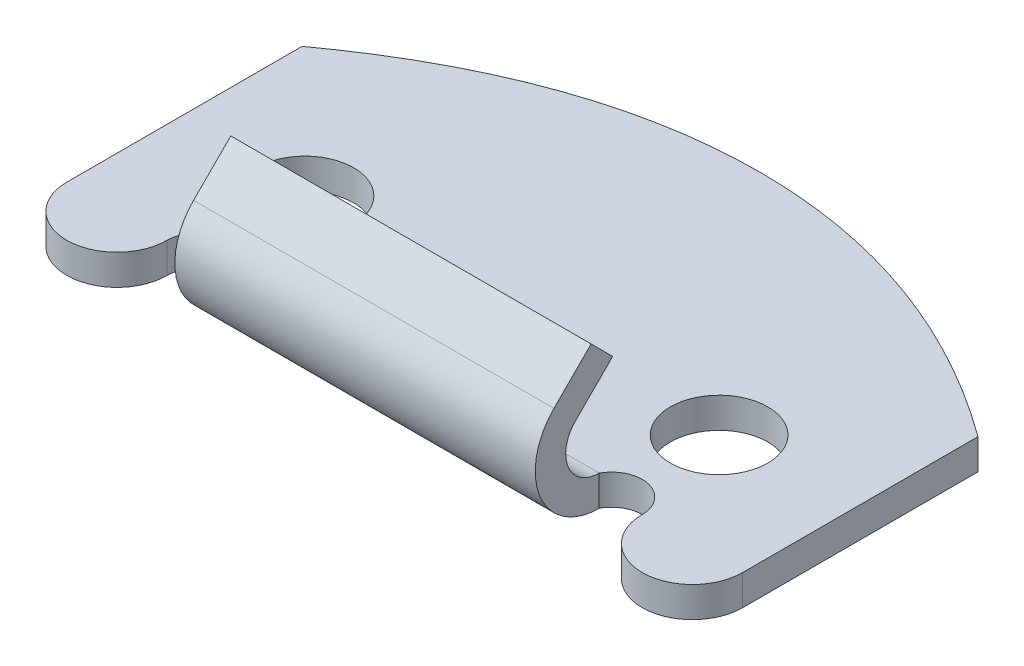
ISO-10303-21;
HEADER;
FILE_DESCRIPTION(('STEP AP214'),'2;1');
FILE_NAME('part.step','',(''),(''),'','','');
FILE_SCHEMA(('AUTOMOTIVE_DESIGN { 1 0 10303 214 1 1 1 1 }'));
ENDSEC;
DATA;
#1=APPLICATION_CONTEXT('core data for automotive mechanical design processes');
#2=APPLICATION_PROTOCOL_DEFINITION('international standard','automotive_design',2000,#1);
#3=PRODUCT_CONTEXT('',#1,'mechanical');
#4=PRODUCT('Part','Part','',(#3));
#5=PRODUCT_RELATED_PRODUCT_CATEGORY('part','',(#4));
#6=PRODUCT_DEFINITION_FORMATION('','',#4);
#7=PRODUCT_DEFINITION_CONTEXT('part definition',#1,'design');
#8=PRODUCT_DEFINITION('design','',#6,#7);
#9=PRODUCT_DEFINITION_SHAPE('','',#8);
#10=(LENGTH_UNIT() NAMED_UNIT(*) SI_UNIT(.MILLI.,.METRE.));
#11=(NAMED_UNIT(*) PLANE_ANGLE_UNIT() SI_UNIT($,.RADIAN.));
#12=(NAMED_UNIT(*) SI_UNIT($,.STERADIAN.) SOLID_ANGLE_UNIT());
#13=UNCERTAINTY_MEASURE_WITH_UNIT(LENGTH_MEASURE(1.E-05),#10,'distance_accuracy_value','');
#14=(GEOMETRIC_REPRESENTATION_CONTEXT(3) GLOBAL_UNCERTAINTY_ASSIGNED_CONTEXT((#13)) GLOBAL_UNIT_ASSIGNED_CONTEXT((#10,
#11,#12)) REPRESENTATION_CONTEXT('',''));
#15=CARTESIAN_POINT('',(0.,0.,0.));
#16=DIRECTION('',(0.,0.,1.));
#17=DIRECTION('',(1.,0.,0.));
#18=AXIS2_PLACEMENT_3D('',#15,#16,#17);
#19=CARTESIAN_POINT('',(-5.61946223736205,1.,-7.15922169796895));
#20=DIRECTION('',(0.,1.,0.));
#21=DIRECTION('',(0.,0.,1.));
#22=AXIS2_PLACEMENT_3D('',#19,#20,#21);
#23=PLANE('',#22);
#24=CARTESIAN_POINT('',(-6.8,1.,0.));
#25=DIRECTION('',(0.,1.,0.));
#26=DIRECTION('',(0.,0.,1.));
#27=AXIS2_PLACEMENT_3D('',#24,#25,#26);
#28=CIRCLE('',#27,1.6);
#29=CARTESIAN_POINT('',(-6.8,1.,1.6));
#30=VERTEX_POINT('',#29);
#31=EDGE_CURVE('E264',#30,#30,#28,.T.);
#32=ORIENTED_EDGE('',*,*,#31,.F.);
#33=EDGE_LOOP('',(#32));
#34=FACE_BOUND('',#33,.T.);
#35=CARTESIAN_POINT('',(0.,1.,-8.14480997862923));
#36=CARTESIAN_POINT('',(-5.6889244747241,1.,-8.14480997862923));
#37=CARTESIAN_POINT('',(-11.1,1.,-4.20245685598809));
#38=B_SPLINE_CURVE_WITH_KNOTS('',2,(#35,#36,#37),.UNSPECIFIED.,.F.,.F.,(3,3),(0.,1.),.UNSPECIFIED.);
#39=CARTESIAN_POINT('',(0.,1.,-8.14480997862923));
#40=VERTEX_POINT('',#39);
#41=CARTESIAN_POINT('',(-11.1,1.,-4.20245685598809));
#42=VERTEX_POINT('',#41);
#43=EDGE_CURVE('E253',#40,#42,#38,.T.);
#44=ORIENTED_EDGE('',*,*,#43,.T.);
#45=DIRECTION('',(0.,0.,1.));
#46=VECTOR('',#45,1.);
#47=CARTESIAN_POINT('',(-11.1,1.,-4.20245685598809));
#48=LINE('',#47,#46);
#49=CARTESIAN_POINT('',(-11.1,1.,3.52530019404084));
#50=VERTEX_POINT('',#49);
#51=EDGE_CURVE('E101',#42,#50,#48,.T.);
#52=ORIENTED_EDGE('',*,*,#51,.T.);
#53=CARTESIAN_POINT('',(-9.45,1.,3.52530019404084));
#54=DIRECTION('',(0.,1.,0.));
#55=DIRECTION('',(0.,0.,1.));
#56=AXIS2_PLACEMENT_3D('',#53,#54,#55);
#57=CIRCLE('',#56,1.65);
#58=CARTESIAN_POINT('',(-7.8,1.,3.52530019404084));
#59=VERTEX_POINT('',#58);
#60=EDGE_CURVE('E251',#50,#59,#57,.T.);
#61=ORIENTED_EDGE('',*,*,#60,.T.);
#62=CARTESIAN_POINT('',(-6.8,1.,3.52530019404084));
#63=DIRECTION('',(0.,-1.,0.));
#64=DIRECTION('',(0.,0.,-1.));
#65=AXIS2_PLACEMENT_3D('',#62,#63,#64);
#66=CIRCLE('',#65,1.);
#67=CARTESIAN_POINT('',(-5.91739225838875,0.999999999999999,3.05519002137077));
#68=VERTEX_POINT('',#67);
#69=EDGE_CURVE('E243',#59,#68,#66,.T.);
#70=ORIENTED_EDGE('',*,*,#69,.T.);
#71=DIRECTION('',(1.,0.,0.));
#72=VECTOR('',#71,1.);
#73=CARTESIAN_POINT('',(-5.91739225838875,1.,3.05519002137077));
#74=LINE('',#73,#72);
#75=CARTESIAN_POINT('',(5.91739225838875,0.999999999999999,3.05519002137077));
#76=VERTEX_POINT('',#75);
#77=EDGE_CURVE('E230',#68,#76,#74,.T.);
#78=ORIENTED_EDGE('',*,*,#77,.T.);
#79=CARTESIAN_POINT('',(6.8,1.,3.52530019404084));
#80=DIRECTION('',(0.,-1.,0.));
#81=DIRECTION('',(0.,0.,1.));
#82=AXIS2_PLACEMENT_3D('',#79,#80,#81);
#83=CIRCLE('',#82,0.999999999999998);
#84=CARTESIAN_POINT('',(7.8,1.,3.52530019404084));
#85=VERTEX_POINT('',#84);
#86=EDGE_CURVE('E121',#76,#85,#83,.T.);
#87=ORIENTED_EDGE('',*,*,#86,.T.);
#88=CARTESIAN_POINT('',(9.45,1.,3.52530019404084));
#89=DIRECTION('',(0.,1.,0.));
#90=DIRECTION('',(0.,0.,-1.));
#91=AXIS2_PLACEMENT_3D('',#88,#89,#90);
#92=CIRCLE('',#91,1.65);
#93=CARTESIAN_POINT('',(11.1,1.,3.52530019404084));
#94=VERTEX_POINT('',#93);
#95=EDGE_CURVE('E114',#85,#94,#92,.T.);
#96=ORIENTED_EDGE('',*,*,#95,.T.);
#97=DIRECTION('',(0.,0.,-1.));
#98=VECTOR('',#97,1.);
#99=CARTESIAN_POINT('',(11.1,1.,-4.2024568559881));
#100=LINE('',#99,#98);
#101=CARTESIAN_POINT('',(11.1,1.,-4.2024568559881));
#102=VERTEX_POINT('',#101);
#103=EDGE_CURVE('E118',#94,#102,#100,.T.);
#104=ORIENTED_EDGE('',*,*,#103,.T.);
#105=CARTESIAN_POINT('',(11.1,1.,-4.2024568559881));
#106=CARTESIAN_POINT('',(5.6889244747241,1.,-8.14480997862923));
#107=CARTESIAN_POINT('',(0.,1.,-8.14480997862923));
#108=B_SPLINE_CURVE_WITH_KNOTS('',2,(#105,#106,#107),.UNSPECIFIED.,.F.,.F.,(3,3),(0.,1.),.UNSPECIFIED.);
#109=EDGE_CURVE('E57',#102,#40,#108,.T.);
#110=ORIENTED_EDGE('',*,*,#109,.T.);
#111=EDGE_LOOP('',(#44,#52,#61,#70,#78,#87,#96,#104,#110));
#112=FACE_BOUND('',#111,.T.);
#113=CARTESIAN_POINT('',(6.8,1.,0.));
#114=DIRECTION('',(0.,1.,0.));
#115=DIRECTION('',(0.,0.,-1.));
#116=AXIS2_PLACEMENT_3D('',#113,#114,#115);
#117=CIRCLE('',#116,1.6);
#118=CARTESIAN_POINT('',(6.8,1.,-1.6));
#119=VERTEX_POINT('',#118);
#120=EDGE_CURVE('E265',#119,#119,#117,.T.);
#121=ORIENTED_EDGE('',*,*,#120,.F.);
#122=EDGE_LOOP('',(#121));
#123=FACE_BOUND('',#122,.T.);
#124=ADVANCED_FACE('F39',(#34,#112,#123),#23,.T.);
#125=CARTESIAN_POINT('',(-5.61946223736205,0.,-7.15922169796895));
#126=DIRECTION('',(0.,1.,0.));
#127=DIRECTION('',(0.,0.,1.));
#128=AXIS2_PLACEMENT_3D('',#125,#126,#127);
#129=PLANE('',#128);
#130=CARTESIAN_POINT('',(0.,0.,-8.14480997862923));
#131=CARTESIAN_POINT('',(-5.6889244747241,0.,-8.14480997862923));
#132=CARTESIAN_POINT('',(-11.1,0.,-4.20245685598809));
#133=B_SPLINE_CURVE_WITH_KNOTS('',2,(#130,#131,#132),.UNSPECIFIED.,.F.,.F.,(3,3),(0.,1.),.UNSPECIFIED.);
#134=CARTESIAN_POINT('',(0.,0.,-8.14480997862923));
#135=VERTEX_POINT('',#134);
#136=CARTESIAN_POINT('',(-11.1,0.,-4.20245685598809));
#137=VERTEX_POINT('',#136);
#138=EDGE_CURVE('E142',#135,#137,#133,.T.);
#139=ORIENTED_EDGE('',*,*,#138,.F.);
#140=CARTESIAN_POINT('',(11.1,0.,-4.2024568559881));
#141=CARTESIAN_POINT('',(5.6889244747241,0.,-8.14480997862923));
#142=CARTESIAN_POINT('',(0.,0.,-8.14480997862923));
#143=B_SPLINE_CURVE_WITH_KNOTS('',2,(#140,#141,#142),.UNSPECIFIED.,.F.,.F.,(3,3),(0.,1.),.UNSPECIFIED.);
#144=CARTESIAN_POINT('',(11.1,0.,-4.2024568559881));
#145=VERTEX_POINT('',#144);
#146=EDGE_CURVE('E93',#145,#135,#143,.T.);
#147=ORIENTED_EDGE('',*,*,#146,.F.);
#148=DIRECTION('',(0.,0.,-1.));
#149=VECTOR('',#148,1.);
#150=CARTESIAN_POINT('',(11.1,0.,-4.2024568559881));
#151=LINE('',#150,#149);
#152=CARTESIAN_POINT('',(11.1,0.,3.52530019404084));
#153=VERTEX_POINT('',#152);
#154=EDGE_CURVE('E87',#153,#145,#151,.T.);
#155=ORIENTED_EDGE('',*,*,#154,.F.);
#156=CARTESIAN_POINT('',(9.45,0.,3.52530019404084));
#157=DIRECTION('',(0.,1.,0.));
#158=DIRECTION('',(0.,0.,-1.));
#159=AXIS2_PLACEMENT_3D('',#156,#157,#158);
#160=CIRCLE('',#159,1.65);
#161=CARTESIAN_POINT('',(7.8,0.,3.52530019404084));
#162=VERTEX_POINT('',#161);
#163=EDGE_CURVE('E129',#162,#153,#160,.T.);
#164=ORIENTED_EDGE('',*,*,#163,.F.);
#165=CARTESIAN_POINT('',(6.8,0.,3.52530019404084));
#166=DIRECTION('',(0.,-1.,0.));
#167=DIRECTION('',(0.,0.,1.));
#168=AXIS2_PLACEMENT_3D('',#165,#166,#167);
#169=CIRCLE('',#168,0.999999999999998);
#170=CARTESIAN_POINT('',(5.91739225838875,0.,3.05519002137077));
#171=VERTEX_POINT('',#170);
#172=EDGE_CURVE('E354',#171,#162,#169,.T.);
#173=ORIENTED_EDGE('',*,*,#172,.F.);
#174=DIRECTION('',(1.,0.,0.));
#175=VECTOR('',#174,1.);
#176=CARTESIAN_POINT('',(-5.91739225838875,0.,3.05519002137077));
#177=LINE('',#176,#175);
#178=CARTESIAN_POINT('',(-5.91739225838875,0.,3.05519002137077));
#179=VERTEX_POINT('',#178);
#180=EDGE_CURVE('E331',#179,#171,#177,.T.);
#181=ORIENTED_EDGE('',*,*,#180,.F.);
#182=CARTESIAN_POINT('',(-6.8,0.,3.52530019404084));
#183=DIRECTION('',(0.,-1.,0.));
#184=DIRECTION('',(0.,0.,-1.));
#185=AXIS2_PLACEMENT_3D('',#182,#183,#184);
#186=CIRCLE('',#185,1.);
#187=CARTESIAN_POINT('',(-7.8,0.,3.52530019404084));
#188=VERTEX_POINT('',#187);
#189=EDGE_CURVE('E349',#188,#179,#186,.T.);
#190=ORIENTED_EDGE('',*,*,#189,.F.);
#191=CARTESIAN_POINT('',(-9.45,0.,3.52530019404084));
#192=DIRECTION('',(0.,1.,0.));
#193=DIRECTION('',(0.,0.,1.));
#194=AXIS2_PLACEMENT_3D('',#191,#192,#193);
#195=CIRCLE('',#194,1.65);
#196=CARTESIAN_POINT('',(-11.1,0.,3.52530019404084));
#197=VERTEX_POINT('',#196);
#198=EDGE_CURVE('E343',#197,#188,#195,.T.);
#199=ORIENTED_EDGE('',*,*,#198,.F.);
#200=DIRECTION('',(0.,0.,1.));
#201=VECTOR('',#200,1.);
#202=CARTESIAN_POINT('',(-11.1,0.,-4.20245685598809));
#203=LINE('',#202,#201);
#204=EDGE_CURVE('E347',#137,#197,#203,.T.);
#205=ORIENTED_EDGE('',*,*,#204,.F.);
#206=EDGE_LOOP('',(#139,#147,#155,#164,#173,#181,#190,#199,#205));
#207=FACE_BOUND('',#206,.T.);
#208=CARTESIAN_POINT('',(-6.8,0.,0.));
#209=DIRECTION('',(0.,1.,0.));
#210=DIRECTION('',(0.,0.,1.));
#211=AXIS2_PLACEMENT_3D('',#208,#209,#210);
#212=CIRCLE('',#211,1.6);
#213=CARTESIAN_POINT('',(-6.8,0.,1.6));
#214=VERTEX_POINT('',#213);
#215=EDGE_CURVE('E258',#214,#214,#212,.T.);
#216=ORIENTED_EDGE('',*,*,#215,.T.);
#217=EDGE_LOOP('',(#216));
#218=FACE_BOUND('',#217,.T.);
#219=CARTESIAN_POINT('',(6.8,0.,0.));
#220=DIRECTION('',(0.,1.,0.));
#221=DIRECTION('',(0.,0.,-1.));
#222=AXIS2_PLACEMENT_3D('',#219,#220,#221);
#223=CIRCLE('',#222,1.6);
#224=CARTESIAN_POINT('',(6.8,0.,-1.6));
#225=VERTEX_POINT('',#224);
#226=EDGE_CURVE('E268',#225,#225,#223,.T.);
#227=ORIENTED_EDGE('',*,*,#226,.T.);
#228=EDGE_LOOP('',(#227));
#229=FACE_BOUND('',#228,.T.);
#230=ADVANCED_FACE('F155',(#207,#218,#229),#129,.F.);
#231=DIRECTION('',(0.,-1.,0.));
#232=VECTOR('',#231,1.);
#233=SURFACE_OF_LINEAR_EXTRUSION('',#38,#232);
#234=ORIENTED_EDGE('',*,*,#138,.T.);
#235=DIRECTION('',(0.,-1.,0.));
#236=VECTOR('',#235,1.);
#237=CARTESIAN_POINT('',(-11.1,1.,-4.20245685598809));
#238=LINE('',#237,#236);
#239=EDGE_CURVE('E11',#42,#137,#238,.T.);
#240=ORIENTED_EDGE('',*,*,#239,.F.);
#241=ORIENTED_EDGE('',*,*,#43,.F.);
#242=DIRECTION('',(0.,-1.,0.));
#243=VECTOR('',#242,1.);
#244=CARTESIAN_POINT('',(0.,1.,-8.14480997862923));
#245=LINE('',#244,#243);
#246=EDGE_CURVE('E135',#40,#135,#245,.T.);
#247=ORIENTED_EDGE('',*,*,#246,.T.);
#248=EDGE_LOOP('',(#234,#240,#241,#247));
#249=FACE_BOUND('',#248,.T.);
#250=ADVANCED_FACE('F41',(#249),#233,.F.);
#251=CARTESIAN_POINT('',(-11.1,1.,-4.20245685598809));
#252=DIRECTION('',(1.,0.,0.));
#253=DIRECTION('',(0.,0.,-1.));
#254=AXIS2_PLACEMENT_3D('',#251,#252,#253);
#255=PLANE('',#254);
#256=ORIENTED_EDGE('',*,*,#204,.T.);
#257=DIRECTION('',(0.,-1.,0.));
#258=VECTOR('',#257,1.);
#259=CARTESIAN_POINT('',(-11.1,1.,3.52530019404084));
#260=LINE('',#259,#258);
#261=EDGE_CURVE('E49',#50,#197,#260,.T.);
#262=ORIENTED_EDGE('',*,*,#261,.F.);
#263=ORIENTED_EDGE('',*,*,#51,.F.);
#264=ORIENTED_EDGE('',*,*,#239,.T.);
#265=EDGE_LOOP('',(#256,#262,#263,#264));
#266=FACE_BOUND('',#265,.T.);
#267=ADVANCED_FACE('F171',(#266),#255,.F.);
#268=CARTESIAN_POINT('',(-9.45,1.,3.52530019404084));
#269=DIRECTION('',(0.,-1.,0.));
#270=DIRECTION('',(0.,0.,-1.));
#271=AXIS2_PLACEMENT_3D('',#268,#269,#270);
#272=CYLINDRICAL_SURFACE('',#271,1.65);
#273=ORIENTED_EDGE('',*,*,#198,.T.);
#274=DIRECTION('',(0.,-1.,0.));
#275=VECTOR('',#274,1.);
#276=CARTESIAN_POINT('',(-7.8,1.,3.52530019404084));
#277=LINE('',#276,#275);
#278=EDGE_CURVE('E334',#59,#188,#277,.T.);
#279=ORIENTED_EDGE('',*,*,#278,.F.);
#280=ORIENTED_EDGE('',*,*,#60,.F.);
#281=ORIENTED_EDGE('',*,*,#261,.T.);
#282=EDGE_LOOP('',(#273,#279,#280,#281));
#283=FACE_BOUND('',#282,.T.);
#284=ADVANCED_FACE('F168',(#283),#272,.T.);
#285=CARTESIAN_POINT('',(-6.8,1.,3.52530019404084));
#286=DIRECTION('',(0.,-1.,0.));
#287=DIRECTION('',(0.,0.,-1.));
#288=AXIS2_PLACEMENT_3D('',#285,#286,#287);
#289=CYLINDRICAL_SURFACE('',#288,1.);
#290=ORIENTED_EDGE('',*,*,#189,.T.);
#291=DIRECTION('',(0.,-1.,0.));
#292=VECTOR('',#291,1.);
#293=CARTESIAN_POINT('',(-5.91739225838875,1.,3.05519002137077));
#294=LINE('',#293,#292);
#295=EDGE_CURVE('E332',#68,#179,#294,.T.);
#296=ORIENTED_EDGE('',*,*,#295,.F.);
#297=ORIENTED_EDGE('',*,*,#69,.F.);
#298=ORIENTED_EDGE('',*,*,#278,.T.);
#299=EDGE_LOOP('',(#290,#296,#297,#298));
#300=FACE_BOUND('',#299,.T.);
#301=ADVANCED_FACE('F164',(#300),#289,.F.);
#302=CARTESIAN_POINT('',(6.8,1.,3.52530019404084));
#303=DIRECTION('',(0.,-1.,0.));
#304=DIRECTION('',(0.,0.,-1.));
#305=AXIS2_PLACEMENT_3D('',#302,#303,#304);
#306=CYLINDRICAL_SURFACE('',#305,0.999999999999998);
#307=ORIENTED_EDGE('',*,*,#172,.T.);
#308=DIRECTION('',(0.,-1.,0.));
#309=VECTOR('',#308,1.);
#310=CARTESIAN_POINT('',(7.8,1.,3.52530019404084));
#311=LINE('',#310,#309);
#312=EDGE_CURVE('E130',#85,#162,#311,.T.);
#313=ORIENTED_EDGE('',*,*,#312,.F.);
#314=ORIENTED_EDGE('',*,*,#86,.F.);
#315=DIRECTION('',(0.,-1.,0.));
#316=VECTOR('',#315,1.);
#317=CARTESIAN_POINT('',(5.91739225838875,1.,3.05519002137077));
#318=LINE('',#317,#316);
#319=EDGE_CURVE('E247',#76,#171,#318,.T.);
#320=ORIENTED_EDGE('',*,*,#319,.T.);
#321=EDGE_LOOP('',(#307,#313,#314,#320));
#322=FACE_BOUND('',#321,.T.);
#323=ADVANCED_FACE('F161',(#322),#306,.F.);
#324=CARTESIAN_POINT('',(9.45,1.,3.52530019404084));
#325=DIRECTION('',(0.,-1.,0.));
#326=DIRECTION('',(0.,0.,-1.));
#327=AXIS2_PLACEMENT_3D('',#324,#325,#326);
#328=CYLINDRICAL_SURFACE('',#327,1.65);
#329=ORIENTED_EDGE('',*,*,#163,.T.);
#330=DIRECTION('',(0.,-1.,0.));
#331=VECTOR('',#330,1.);
#332=CARTESIAN_POINT('',(11.1,1.,3.52530019404084));
#333=LINE('',#332,#331);
#334=EDGE_CURVE('E126',#94,#153,#333,.T.);
#335=ORIENTED_EDGE('',*,*,#334,.F.);
#336=ORIENTED_EDGE('',*,*,#95,.F.);
#337=ORIENTED_EDGE('',*,*,#312,.T.);
#338=EDGE_LOOP('',(#329,#335,#336,#337));
#339=FACE_BOUND('',#338,.T.);
#340=ADVANCED_FACE('F127',(#339),#328,.T.);
#341=CARTESIAN_POINT('',(11.1,1.,-4.2024568559881));
#342=DIRECTION('',(-1.,0.,0.));
#343=DIRECTION('',(0.,0.,1.));
#344=AXIS2_PLACEMENT_3D('',#341,#342,#343);
#345=PLANE('',#344);
#346=ORIENTED_EDGE('',*,*,#154,.T.);
#347=DIRECTION('',(0.,-1.,0.));
#348=VECTOR('',#347,1.);
#349=CARTESIAN_POINT('',(11.1,1.,-4.2024568559881));
#350=LINE('',#349,#348);
#351=EDGE_CURVE('E131',#102,#145,#350,.T.);
#352=ORIENTED_EDGE('',*,*,#351,.F.);
#353=ORIENTED_EDGE('',*,*,#103,.F.);
#354=ORIENTED_EDGE('',*,*,#334,.T.);
#355=EDGE_LOOP('',(#346,#352,#353,#354));
#356=FACE_BOUND('',#355,.T.);
#357=ADVANCED_FACE('F133',(#356),#345,.F.);
#358=DIRECTION('',(0.,-1.,0.));
#359=VECTOR('',#358,1.);
#360=SURFACE_OF_LINEAR_EXTRUSION('',#108,#359);
#361=ORIENTED_EDGE('',*,*,#146,.T.);
#362=ORIENTED_EDGE('',*,*,#246,.F.);
#363=ORIENTED_EDGE('',*,*,#109,.F.);
#364=ORIENTED_EDGE('',*,*,#351,.T.);
#365=EDGE_LOOP('',(#361,#362,#363,#364));
#366=FACE_BOUND('',#365,.T.);
#367=ADVANCED_FACE('F150',(#366),#360,.F.);
#368=CARTESIAN_POINT('',(-6.8,1.,0.));
#369=DIRECTION('',(0.,-1.,0.));
#370=DIRECTION('',(0.,0.,-1.));
#371=AXIS2_PLACEMENT_3D('',#368,#369,#370);
#372=CYLINDRICAL_SURFACE('',#371,1.6);
#373=ORIENTED_EDGE('',*,*,#31,.T.);
#374=EDGE_LOOP('',(#373));
#375=FACE_BOUND('',#374,.T.);
#376=ORIENTED_EDGE('',*,*,#215,.F.);
#377=EDGE_LOOP('',(#376));
#378=FACE_BOUND('',#377,.T.);
#379=ADVANCED_FACE('F154',(#375,#378),#372,.F.);
#380=CARTESIAN_POINT('',(6.8,1.,0.));
#381=DIRECTION('',(0.,-1.,0.));
#382=DIRECTION('',(0.,0.,-1.));
#383=AXIS2_PLACEMENT_3D('',#380,#381,#382);
#384=CYLINDRICAL_SURFACE('',#383,1.6);
#385=ORIENTED_EDGE('',*,*,#120,.T.);
#386=EDGE_LOOP('',(#385));
#387=FACE_BOUND('',#386,.T.);
#388=ORIENTED_EDGE('',*,*,#226,.F.);
#389=EDGE_LOOP('',(#388));
#390=FACE_BOUND('',#389,.T.);
#391=ADVANCED_FACE('F188',(#387,#390),#384,.F.);
#392=CARTESIAN_POINT('',(-5.91739225838875,3.58492424049176,4.54011426186251));
#393=DIRECTION('',(-1.,0.,0.));
#394=DIRECTION('',(0.,0.707106781186544,-0.707106781186551));
#395=AXIS2_PLACEMENT_3D('',#392,#393,#394);
#396=PLANE('',#395);
#397=DIRECTION('',(0.,0.707106781186544,-0.707106781186552));
#398=VECTOR('',#397,1.);
#399=CARTESIAN_POINT('',(-5.91739225838875,2.8778174593052,3.83300748067597));
#400=LINE('',#399,#398);
#401=CARTESIAN_POINT('',(-5.91739225838875,2.8778174593052,3.83300748067597));
#402=VERTEX_POINT('',#401);
#403=CARTESIAN_POINT('',(-5.91739225838875,4.09875835418482,2.61206658579634));
#404=VERTEX_POINT('',#403);
#405=EDGE_CURVE('E291',#402,#404,#400,.T.);
#406=ORIENTED_EDGE('',*,*,#405,.F.);
#407=CARTESIAN_POINT('',(-5.91739225838875,2.1,3.05519002137077));
#408=DIRECTION('',(1.,0.,0.));
#409=DIRECTION('',(0.,0.,-1.));
#410=AXIS2_PLACEMENT_3D('',#407,#408,#409);
#411=CIRCLE('',#410,1.1);
#412=EDGE_CURVE('E297',#68,#402,#411,.F.);
#413=ORIENTED_EDGE('',*,*,#412,.F.);
#414=ORIENTED_EDGE('',*,*,#295,.T.);
#415=CARTESIAN_POINT('',(-5.91739225838875,2.1,3.05519002137077));
#416=DIRECTION('',(-1.,0.,0.));
#417=DIRECTION('',(0.,0.,1.));
#418=AXIS2_PLACEMENT_3D('',#415,#416,#417);
#419=CIRCLE('',#418,2.1);
#420=CARTESIAN_POINT('',(-5.91739225838875,3.58492424049176,4.54011426186251));
#421=VERTEX_POINT('',#420);
#422=EDGE_CURVE('E288',#179,#421,#419,.T.);
#423=ORIENTED_EDGE('',*,*,#422,.T.);
#424=DIRECTION('',(0.,0.707106781186544,-0.707106781186551));
#425=VECTOR('',#424,1.);
#426=CARTESIAN_POINT('',(-5.91739225838875,3.58492424049176,4.54011426186251));
#427=LINE('',#426,#425);
#428=CARTESIAN_POINT('',(-5.91739225838875,4.80586513537137,3.31917336698288));
#429=VERTEX_POINT('',#428);
#430=EDGE_CURVE('E292',#421,#429,#427,.T.);
#431=ORIENTED_EDGE('',*,*,#430,.T.);
#432=DIRECTION('',(0.,-0.707106781186551,-0.707106781186543));
#433=VECTOR('',#432,1.);
#434=CARTESIAN_POINT('',(-5.91739225838875,4.80586513537137,3.31917336698288));
#435=LINE('',#434,#433);
#436=EDGE_CURVE('E271',#429,#404,#435,.T.);
#437=ORIENTED_EDGE('',*,*,#436,.T.);
#438=EDGE_LOOP('',(#406,#413,#414,#423,#431,#437));
#439=FACE_BOUND('',#438,.T.);
#440=ADVANCED_FACE('F192',(#439),#396,.T.);
#441=CARTESIAN_POINT('',(0.,4.80586513537137,3.31917336698288));
#442=DIRECTION('',(0.,0.707106781186544,-0.707106781186552));
#443=DIRECTION('',(1.,0.,0.));
#444=AXIS2_PLACEMENT_3D('',#441,#442,#443);
#445=PLANE('',#444);
#446=ORIENTED_EDGE('',*,*,#436,.F.);
#447=DIRECTION('',(1.,0.,0.));
#448=VECTOR('',#447,1.);
#449=CARTESIAN_POINT('',(0.,4.80586513537137,3.31917336698288));
#450=LINE('',#449,#448);
#451=CARTESIAN_POINT('',(5.91739225838875,4.80586513537137,3.31917336698288));
#452=VERTEX_POINT('',#451);
#453=EDGE_CURVE('E281',#429,#452,#450,.T.);
#454=ORIENTED_EDGE('',*,*,#453,.T.);
#455=DIRECTION('',(0.,-0.707106781186551,-0.707106781186543));
#456=VECTOR('',#455,1.);
#457=CARTESIAN_POINT('',(5.91739225838875,4.80586513537137,3.31917336698288));
#458=LINE('',#457,#456);
#459=CARTESIAN_POINT('',(5.91739225838875,4.09875835418482,2.61206658579634));
#460=VERTEX_POINT('',#459);
#461=EDGE_CURVE('E239',#452,#460,#458,.T.);
#462=ORIENTED_EDGE('',*,*,#461,.T.);
#463=DIRECTION('',(1.,0.,0.));
#464=VECTOR('',#463,1.);
#465=CARTESIAN_POINT('',(0.,4.09875835418482,2.61206658579634));
#466=LINE('',#465,#464);
#467=EDGE_CURVE('E240',#404,#460,#466,.T.);
#468=ORIENTED_EDGE('',*,*,#467,.F.);
#469=EDGE_LOOP('',(#446,#454,#462,#468));
#470=FACE_BOUND('',#469,.T.);
#471=ADVANCED_FACE('F196',(#470),#445,.T.);
#472=CARTESIAN_POINT('',(5.91739225838875,2.1,3.05519002137077));
#473=DIRECTION('',(1.,0.,0.));
#474=DIRECTION('',(0.,0.,-1.));
#475=AXIS2_PLACEMENT_3D('',#472,#473,#474);
#476=PLANE('',#475);
#477=CARTESIAN_POINT('',(5.91739225838875,2.1,3.05519002137077));
#478=DIRECTION('',(1.,0.,0.));
#479=DIRECTION('',(0.,0.,-1.));
#480=AXIS2_PLACEMENT_3D('',#477,#478,#479);
#481=CIRCLE('',#480,1.1);
#482=CARTESIAN_POINT('',(5.91739225838875,2.8778174593052,3.83300748067597));
#483=VERTEX_POINT('',#482);
#484=EDGE_CURVE('E227',#76,#483,#481,.F.);
#485=ORIENTED_EDGE('',*,*,#484,.T.);
#486=DIRECTION('',(0.,0.707106781186544,-0.707106781186552));
#487=VECTOR('',#486,1.);
#488=CARTESIAN_POINT('',(5.91739225838875,2.8778174593052,3.83300748067597));
#489=LINE('',#488,#487);
#490=EDGE_CURVE('E299',#483,#460,#489,.T.);
#491=ORIENTED_EDGE('',*,*,#490,.T.);
#492=ORIENTED_EDGE('',*,*,#461,.F.);
#493=DIRECTION('',(0.,0.707106781186544,-0.707106781186551));
#494=VECTOR('',#493,1.);
#495=CARTESIAN_POINT('',(5.91739225838875,3.58492424049176,4.54011426186251));
#496=LINE('',#495,#494);
#497=CARTESIAN_POINT('',(5.91739225838875,3.58492424049176,4.54011426186251));
#498=VERTEX_POINT('',#497);
#499=EDGE_CURVE('E282',#498,#452,#496,.T.);
#500=ORIENTED_EDGE('',*,*,#499,.F.);
#501=CARTESIAN_POINT('',(5.91739225838875,2.1,3.05519002137077));
#502=DIRECTION('',(-1.,0.,0.));
#503=DIRECTION('',(0.,0.,1.));
#504=AXIS2_PLACEMENT_3D('',#501,#502,#503);
#505=CIRCLE('',#504,2.1);
#506=EDGE_CURVE('E285',#171,#498,#505,.T.);
#507=ORIENTED_EDGE('',*,*,#506,.F.);
#508=ORIENTED_EDGE('',*,*,#319,.F.);
#509=EDGE_LOOP('',(#485,#491,#492,#500,#507,#508));
#510=FACE_BOUND('',#509,.T.);
#511=ADVANCED_FACE('F200',(#510),#476,.T.);
#512=CARTESIAN_POINT('',(0.,2.1,3.05519002137077));
#513=DIRECTION('',(1.,0.,0.));
#514=DIRECTION('',(0.,0.,-1.));
#515=AXIS2_PLACEMENT_3D('',#512,#513,#514);
#516=CYLINDRICAL_SURFACE('',#515,1.1);
#517=ORIENTED_EDGE('',*,*,#484,.F.);
#518=ORIENTED_EDGE('',*,*,#77,.F.);
#519=ORIENTED_EDGE('',*,*,#412,.T.);
#520=DIRECTION('',(1.,0.,0.));
#521=VECTOR('',#520,1.);
#522=CARTESIAN_POINT('',(0.,2.8778174593052,3.83300748067597));
#523=LINE('',#522,#521);
#524=EDGE_CURVE('E234',#402,#483,#523,.T.);
#525=ORIENTED_EDGE('',*,*,#524,.T.);
#526=EDGE_LOOP('',(#517,#518,#519,#525));
#527=FACE_BOUND('',#526,.T.);
#528=ADVANCED_FACE('F204',(#527),#516,.F.);
#529=CARTESIAN_POINT('',(0.,2.8778174593052,3.83300748067597));
#530=DIRECTION('',(0.,-0.707106781186551,-0.707106781186543));
#531=DIRECTION('',(0.,0.707106781186544,-0.707106781186552));
#532=AXIS2_PLACEMENT_3D('',#529,#530,#531);
#533=PLANE('',#532);
#534=ORIENTED_EDGE('',*,*,#490,.F.);
#535=ORIENTED_EDGE('',*,*,#524,.F.);
#536=ORIENTED_EDGE('',*,*,#405,.T.);
#537=ORIENTED_EDGE('',*,*,#467,.T.);
#538=EDGE_LOOP('',(#534,#535,#536,#537));
#539=FACE_BOUND('',#538,.T.);
#540=ADVANCED_FACE('F210',(#539),#533,.T.);
#541=CARTESIAN_POINT('',(0.,2.1,3.05519002137077));
#542=DIRECTION('',(1.,0.,0.));
#543=DIRECTION('',(0.,0.,-1.));
#544=AXIS2_PLACEMENT_3D('',#541,#542,#543);
#545=CYLINDRICAL_SURFACE('',#544,2.1);
#546=ORIENTED_EDGE('',*,*,#506,.T.);
#547=DIRECTION('',(1.,0.,0.));
#548=VECTOR('',#547,1.);
#549=CARTESIAN_POINT('',(0.,3.58492424049176,4.54011426186251));
#550=LINE('',#549,#548);
#551=EDGE_CURVE('E278',#421,#498,#550,.T.);
#552=ORIENTED_EDGE('',*,*,#551,.F.);
#553=ORIENTED_EDGE('',*,*,#422,.F.);
#554=ORIENTED_EDGE('',*,*,#180,.T.);
#555=EDGE_LOOP('',(#546,#552,#553,#554));
#556=FACE_BOUND('',#555,.T.);
#557=ADVANCED_FACE('F206',(#556),#545,.T.);
#558=CARTESIAN_POINT('',(0.,3.58492424049176,4.54011426186251));
#559=DIRECTION('',(0.,-0.707106781186551,-0.707106781186543));
#560=DIRECTION('',(0.,0.707106781186544,-0.707106781186552));
#561=AXIS2_PLACEMENT_3D('',#558,#559,#560);
#562=PLANE('',#561);
#563=ORIENTED_EDGE('',*,*,#499,.T.);
#564=ORIENTED_EDGE('',*,*,#453,.F.);
#565=ORIENTED_EDGE('',*,*,#430,.F.);
#566=ORIENTED_EDGE('',*,*,#551,.T.);
#567=EDGE_LOOP('',(#563,#564,#565,#566));
#568=FACE_BOUND('',#567,.T.);
#569=ADVANCED_FACE('F209',(#568),#562,.F.);
#570=CLOSED_SHELL('',(#124,#230,#250,#267,#284,#301,#323,#340,#357,#367,#379,#391,#440,#471,
#511,#528,#540,#557,#569));
#571=MANIFOLD_SOLID_BREP('B2',#570);
#572=ADVANCED_BREP_SHAPE_REPRESENTATION('',(#18,#571),#14);
#573=SHAPE_DEFINITION_REPRESENTATION(#9,#572);
ENDSEC;
END-ISO-10303-21;
